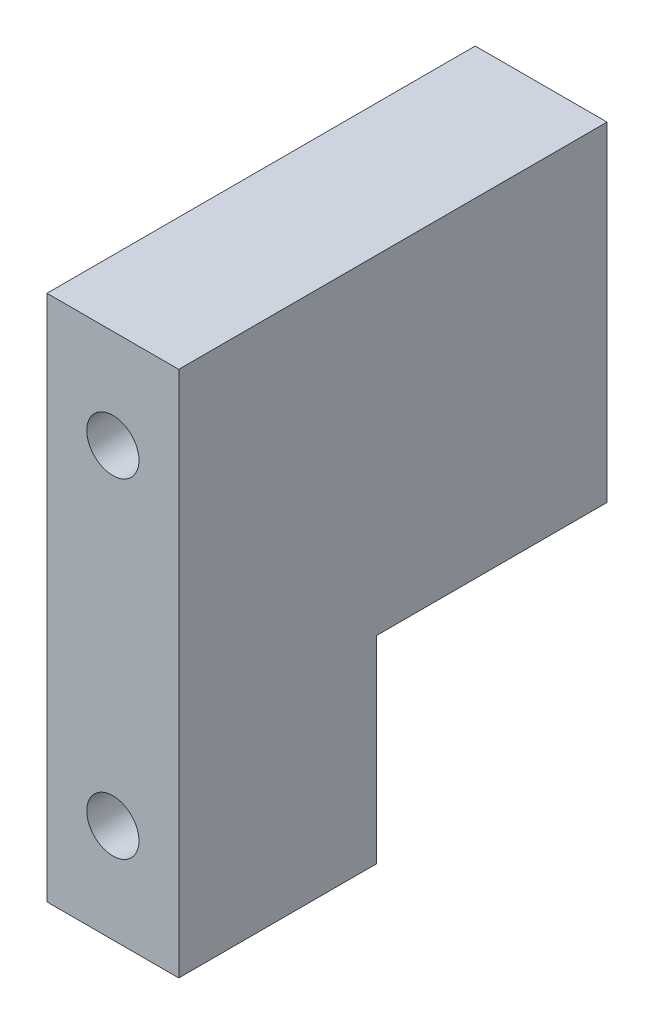
ISO-10303-21;
HEADER;
FILE_DESCRIPTION(('STEP AP214'),'2;1');
FILE_NAME('part.step','',(''),(''),'','','');
FILE_SCHEMA(('AUTOMOTIVE_DESIGN { 1 0 10303 214 1 1 1 1 }'));
ENDSEC;
DATA;
#1=APPLICATION_CONTEXT('core data for automotive mechanical design processes');
#2=APPLICATION_PROTOCOL_DEFINITION('international standard','automotive_design',2000,#1);
#3=PRODUCT_CONTEXT('',#1,'mechanical');
#4=PRODUCT('Part','Part','',(#3));
#5=PRODUCT_RELATED_PRODUCT_CATEGORY('part','',(#4));
#6=PRODUCT_DEFINITION_FORMATION('','',#4);
#7=PRODUCT_DEFINITION_CONTEXT('part definition',#1,'design');
#8=PRODUCT_DEFINITION('design','',#6,#7);
#9=PRODUCT_DEFINITION_SHAPE('','',#8);
#10=(LENGTH_UNIT() NAMED_UNIT(*) SI_UNIT(.MILLI.,.METRE.));
#11=(NAMED_UNIT(*) PLANE_ANGLE_UNIT() SI_UNIT($,.RADIAN.));
#12=(NAMED_UNIT(*) SI_UNIT($,.STERADIAN.) SOLID_ANGLE_UNIT());
#13=UNCERTAINTY_MEASURE_WITH_UNIT(LENGTH_MEASURE(1.E-05),#10,'distance_accuracy_value','');
#14=(GEOMETRIC_REPRESENTATION_CONTEXT(3) GLOBAL_UNCERTAINTY_ASSIGNED_CONTEXT((#13)) GLOBAL_UNIT_ASSIGNED_CONTEXT((#10,
#11,#12)) REPRESENTATION_CONTEXT('',''));
#15=CARTESIAN_POINT('',(0.,0.,0.));
#16=DIRECTION('',(0.,0.,1.));
#17=DIRECTION('',(1.,0.,0.));
#18=AXIS2_PLACEMENT_3D('',#15,#16,#17);
#19=CARTESIAN_POINT('',(-34.925,25.4,-12.7));
#20=DIRECTION('',(1.,0.,0.));
#21=DIRECTION('',(0.,1.,0.));
#22=AXIS2_PLACEMENT_3D('',#19,#20,#21);
#23=PLANE('',#22);
#24=DIRECTION('',(0.,-1.,0.));
#25=VECTOR('',#24,1.);
#26=CARTESIAN_POINT('',(-34.925,-37.7025222840827,9.525));
#27=LINE('',#26,#25);
#28=CARTESIAN_POINT('',(-34.925,-6.35,9.525));
#29=VERTEX_POINT('',#28);
#30=CARTESIAN_POINT('',(-34.925,-25.4,9.525));
#31=VERTEX_POINT('',#30);
#32=EDGE_CURVE('E107',#29,#31,#27,.T.);
#33=ORIENTED_EDGE('',*,*,#32,.F.);
#34=DIRECTION('',(0.,0.,1.));
#35=VECTOR('',#34,1.);
#36=CARTESIAN_POINT('',(-34.925,-6.35,-12.7));
#37=LINE('',#36,#35);
#38=CARTESIAN_POINT('',(-34.925,-6.35,-12.7));
#39=VERTEX_POINT('',#38);
#40=EDGE_CURVE('E101',#39,#29,#37,.T.);
#41=ORIENTED_EDGE('',*,*,#40,.F.);
#42=DIRECTION('',(0.,1.,0.));
#43=VECTOR('',#42,1.);
#44=CARTESIAN_POINT('',(-34.925,25.4,-12.7));
#45=LINE('',#44,#43);
#46=CARTESIAN_POINT('',(-34.925,25.4,-12.7));
#47=VERTEX_POINT('',#46);
#48=EDGE_CURVE('E87',#39,#47,#45,.T.);
#49=ORIENTED_EDGE('',*,*,#48,.T.);
#50=DIRECTION('',(0.,0.,1.));
#51=VECTOR('',#50,1.);
#52=CARTESIAN_POINT('',(-34.925,25.4,-12.7));
#53=LINE('',#52,#51);
#54=CARTESIAN_POINT('',(-34.925,25.4,28.575));
#55=VERTEX_POINT('',#54);
#56=EDGE_CURVE('E11',#47,#55,#53,.T.);
#57=ORIENTED_EDGE('',*,*,#56,.T.);
#58=DIRECTION('',(0.,-1.,0.));
#59=VECTOR('',#58,1.);
#60=CARTESIAN_POINT('',(-34.925,25.4,28.575));
#61=LINE('',#60,#59);
#62=CARTESIAN_POINT('',(-34.925,-25.4,28.575));
#63=VERTEX_POINT('',#62);
#64=EDGE_CURVE('E155',#55,#63,#61,.T.);
#65=ORIENTED_EDGE('',*,*,#64,.T.);
#66=DIRECTION('',(0.,0.,-1.));
#67=VECTOR('',#66,1.);
#68=CARTESIAN_POINT('',(-34.925,-25.4,-12.7));
#69=LINE('',#68,#67);
#70=EDGE_CURVE('E92',#63,#31,#69,.T.);
#71=ORIENTED_EDGE('',*,*,#70,.T.);
#72=EDGE_LOOP('',(#33,#41,#49,#57,#65,#71));
#73=FACE_BOUND('',#72,.T.);
#74=ADVANCED_FACE('F17',(#73),#23,.T.);
#75=CARTESIAN_POINT('',(-47.625,25.4,-12.7));
#76=DIRECTION('',(0.,1.,0.));
#77=DIRECTION('',(1.,0.,0.));
#78=AXIS2_PLACEMENT_3D('',#75,#76,#77);
#79=PLANE('',#78);
#80=DIRECTION('',(-1.,0.,0.));
#81=VECTOR('',#80,1.);
#82=CARTESIAN_POINT('',(-47.625,25.4,-12.7));
#83=LINE('',#82,#81);
#84=CARTESIAN_POINT('',(-47.625,25.4,-12.7));
#85=VERTEX_POINT('',#84);
#86=EDGE_CURVE('E25',#47,#85,#83,.T.);
#87=ORIENTED_EDGE('',*,*,#86,.T.);
#88=DIRECTION('',(0.,0.,1.));
#89=VECTOR('',#88,1.);
#90=CARTESIAN_POINT('',(-47.625,25.4,-12.7));
#91=LINE('',#90,#89);
#92=CARTESIAN_POINT('',(-47.625,25.4,28.575));
#93=VERTEX_POINT('',#92);
#94=EDGE_CURVE('E142',#85,#93,#91,.T.);
#95=ORIENTED_EDGE('',*,*,#94,.T.);
#96=DIRECTION('',(1.,0.,0.));
#97=VECTOR('',#96,1.);
#98=CARTESIAN_POINT('',(-47.625,25.4,28.575));
#99=LINE('',#98,#97);
#100=EDGE_CURVE('E144',#93,#55,#99,.T.);
#101=ORIENTED_EDGE('',*,*,#100,.T.);
#102=ORIENTED_EDGE('',*,*,#56,.F.);
#103=EDGE_LOOP('',(#87,#95,#101,#102));
#104=FACE_BOUND('',#103,.T.);
#105=ADVANCED_FACE('F159',(#104),#79,.T.);
#106=CARTESIAN_POINT('',(-41.275,0.,-12.7));
#107=DIRECTION('',(0.,0.,1.));
#108=DIRECTION('',(1.,0.,0.));
#109=AXIS2_PLACEMENT_3D('',#106,#107,#108);
#110=PLANE('',#109);
#111=CARTESIAN_POINT('',(-41.275,15.875,-12.7));
#112=DIRECTION('',(0.,0.,-1.));
#113=DIRECTION('',(-1.,0.,0.));
#114=AXIS2_PLACEMENT_3D('',#111,#112,#113);
#115=CIRCLE('',#114,2.286);
#116=CARTESIAN_POINT('',(-43.561,15.875,-12.7));
#117=VERTEX_POINT('',#116);
#118=EDGE_CURVE('E115',#117,#117,#115,.T.);
#119=ORIENTED_EDGE('',*,*,#118,.F.);
#120=EDGE_LOOP('',(#119));
#121=FACE_BOUND('',#120,.T.);
#122=ORIENTED_EDGE('',*,*,#48,.F.);
#123=DIRECTION('',(-1.,0.,0.));
#124=VECTOR('',#123,1.);
#125=CARTESIAN_POINT('',(-41.275,-6.35,-12.7));
#126=LINE('',#125,#124);
#127=CARTESIAN_POINT('',(-47.625,-6.35,-12.7));
#128=VERTEX_POINT('',#127);
#129=EDGE_CURVE('E93',#39,#128,#126,.T.);
#130=ORIENTED_EDGE('',*,*,#129,.T.);
#131=DIRECTION('',(0.,-1.,0.));
#132=VECTOR('',#131,1.);
#133=CARTESIAN_POINT('',(-47.625,0.,-12.7));
#134=LINE('',#133,#132);
#135=EDGE_CURVE('E148',#85,#128,#134,.T.);
#136=ORIENTED_EDGE('',*,*,#135,.F.);
#137=ORIENTED_EDGE('',*,*,#86,.F.);
#138=EDGE_LOOP('',(#122,#130,#136,#137));
#139=FACE_BOUND('',#138,.T.);
#140=ADVANCED_FACE('F90',(#121,#139),#110,.F.);
#141=CARTESIAN_POINT('',(-34.925,-25.4,-12.7));
#142=DIRECTION('',(0.,-1.,0.));
#143=DIRECTION('',(0.,0.,-1.));
#144=AXIS2_PLACEMENT_3D('',#141,#142,#143);
#145=PLANE('',#144);
#146=DIRECTION('',(-1.,0.,0.));
#147=VECTOR('',#146,1.);
#148=CARTESIAN_POINT('',(-34.925,-25.4,9.525));
#149=LINE('',#148,#147);
#150=CARTESIAN_POINT('',(-47.625,-25.4,9.525));
#151=VERTEX_POINT('',#150);
#152=EDGE_CURVE('E104',#31,#151,#149,.T.);
#153=ORIENTED_EDGE('',*,*,#152,.F.);
#154=ORIENTED_EDGE('',*,*,#70,.F.);
#155=DIRECTION('',(-1.,0.,0.));
#156=VECTOR('',#155,1.);
#157=CARTESIAN_POINT('',(-34.925,-25.4,28.575));
#158=LINE('',#157,#156);
#159=CARTESIAN_POINT('',(-47.625,-25.4,28.575));
#160=VERTEX_POINT('',#159);
#161=EDGE_CURVE('E149',#63,#160,#158,.T.);
#162=ORIENTED_EDGE('',*,*,#161,.T.);
#163=DIRECTION('',(0.,0.,-1.));
#164=VECTOR('',#163,1.);
#165=CARTESIAN_POINT('',(-47.625,-25.4,-12.7));
#166=LINE('',#165,#164);
#167=EDGE_CURVE('E134',#160,#151,#166,.T.);
#168=ORIENTED_EDGE('',*,*,#167,.T.);
#169=EDGE_LOOP('',(#153,#154,#162,#168));
#170=FACE_BOUND('',#169,.T.);
#171=ADVANCED_FACE('F218',(#170),#145,.T.);
#172=CARTESIAN_POINT('',(0.,0.,28.575));
#173=DIRECTION('',(0.,0.,1.));
#174=DIRECTION('',(1.,0.,0.));
#175=AXIS2_PLACEMENT_3D('',#172,#173,#174);
#176=PLANE('',#175);
#177=CARTESIAN_POINT('',(-41.275,-15.875,28.575));
#178=DIRECTION('',(0.,0.,1.));
#179=DIRECTION('',(1.,0.,0.));
#180=AXIS2_PLACEMENT_3D('',#177,#178,#179);
#181=CIRCLE('',#180,2.5146);
#182=CARTESIAN_POINT('',(-38.7604,-15.875,28.575));
#183=VERTEX_POINT('',#182);
#184=EDGE_CURVE('E180',#183,#183,#181,.T.);
#185=ORIENTED_EDGE('',*,*,#184,.F.);
#186=EDGE_LOOP('',(#185));
#187=FACE_BOUND('',#186,.T.);
#188=CARTESIAN_POINT('',(-41.275,15.875,28.575));
#189=DIRECTION('',(0.,0.,1.));
#190=DIRECTION('',(1.,0.,0.));
#191=AXIS2_PLACEMENT_3D('',#188,#189,#190);
#192=CIRCLE('',#191,2.5146);
#193=CARTESIAN_POINT('',(-38.7604,15.875,28.575));
#194=VERTEX_POINT('',#193);
#195=EDGE_CURVE('E176',#194,#194,#192,.T.);
#196=ORIENTED_EDGE('',*,*,#195,.F.);
#197=EDGE_LOOP('',(#196));
#198=FACE_BOUND('',#197,.T.);
#199=DIRECTION('',(0.,-1.,0.));
#200=VECTOR('',#199,1.);
#201=CARTESIAN_POINT('',(-47.625,0.,28.575));
#202=LINE('',#201,#200);
#203=EDGE_CURVE('E138',#93,#160,#202,.T.);
#204=ORIENTED_EDGE('',*,*,#203,.T.);
#205=ORIENTED_EDGE('',*,*,#161,.F.);
#206=ORIENTED_EDGE('',*,*,#64,.F.);
#207=ORIENTED_EDGE('',*,*,#100,.F.);
#208=EDGE_LOOP('',(#204,#205,#206,#207));
#209=FACE_BOUND('',#208,.T.);
#210=ADVANCED_FACE('F240',(#187,#198,#209),#176,.T.);
#211=CARTESIAN_POINT('',(-47.625,-25.4,-12.7));
#212=DIRECTION('',(-1.,0.,0.));
#213=DIRECTION('',(0.,0.,1.));
#214=AXIS2_PLACEMENT_3D('',#211,#212,#213);
#215=PLANE('',#214);
#216=DIRECTION('',(0.,-1.,0.));
#217=VECTOR('',#216,1.);
#218=CARTESIAN_POINT('',(-47.625,-37.7025222840827,9.525));
#219=LINE('',#218,#217);
#220=CARTESIAN_POINT('',(-47.625,-6.35,9.525));
#221=VERTEX_POINT('',#220);
#222=EDGE_CURVE('E131',#221,#151,#219,.T.);
#223=ORIENTED_EDGE('',*,*,#222,.T.);
#224=ORIENTED_EDGE('',*,*,#167,.F.);
#225=ORIENTED_EDGE('',*,*,#203,.F.);
#226=ORIENTED_EDGE('',*,*,#94,.F.);
#227=ORIENTED_EDGE('',*,*,#135,.T.);
#228=DIRECTION('',(0.,0.,1.));
#229=VECTOR('',#228,1.);
#230=CARTESIAN_POINT('',(-47.625,-6.35,-31.9741630263985));
#231=LINE('',#230,#229);
#232=EDGE_CURVE('E103',#128,#221,#231,.T.);
#233=ORIENTED_EDGE('',*,*,#232,.T.);
#234=EDGE_LOOP('',(#223,#224,#225,#226,#227,#233));
#235=FACE_BOUND('',#234,.T.);
#236=ADVANCED_FACE('F163',(#235),#215,.T.);
#237=CARTESIAN_POINT('',(-47.625,-37.7025222840827,9.525));
#238=DIRECTION('',(0.,0.,1.));
#239=DIRECTION('',(1.,0.,0.));
#240=AXIS2_PLACEMENT_3D('',#237,#238,#239);
#241=PLANE('',#240);
#242=CARTESIAN_POINT('',(-41.275,-15.875,9.525));
#243=DIRECTION('',(0.,0.,-1.));
#244=DIRECTION('',(1.,0.,0.));
#245=AXIS2_PLACEMENT_3D('',#242,#243,#244);
#246=CIRCLE('',#245,2.286);
#247=CARTESIAN_POINT('',(-38.989,-15.875,9.525));
#248=VERTEX_POINT('',#247);
#249=EDGE_CURVE('E181',#248,#248,#246,.T.);
#250=ORIENTED_EDGE('',*,*,#249,.F.);
#251=EDGE_LOOP('',(#250));
#252=FACE_BOUND('',#251,.T.);
#253=ORIENTED_EDGE('',*,*,#152,.T.);
#254=ORIENTED_EDGE('',*,*,#222,.F.);
#255=DIRECTION('',(1.,0.,0.));
#256=VECTOR('',#255,1.);
#257=CARTESIAN_POINT('',(-47.625,-6.35,9.525));
#258=LINE('',#257,#256);
#259=EDGE_CURVE('E112',#221,#29,#258,.T.);
#260=ORIENTED_EDGE('',*,*,#259,.T.);
#261=ORIENTED_EDGE('',*,*,#32,.T.);
#262=EDGE_LOOP('',(#253,#254,#260,#261));
#263=FACE_BOUND('',#262,.T.);
#264=ADVANCED_FACE('F221',(#252,#263),#241,.F.);
#265=CARTESIAN_POINT('',(-47.625,-6.35,-31.9741630263985));
#266=DIRECTION('',(0.,1.,0.));
#267=DIRECTION('',(1.,0.,0.));
#268=AXIS2_PLACEMENT_3D('',#265,#266,#267);
#269=PLANE('',#268);
#270=ORIENTED_EDGE('',*,*,#40,.T.);
#271=ORIENTED_EDGE('',*,*,#259,.F.);
#272=ORIENTED_EDGE('',*,*,#232,.F.);
#273=ORIENTED_EDGE('',*,*,#129,.F.);
#274=EDGE_LOOP('',(#270,#271,#272,#273));
#275=FACE_BOUND('',#274,.T.);
#276=ADVANCED_FACE('F97',(#275),#269,.F.);
#277=CARTESIAN_POINT('',(-41.275,15.875,13.335));
#278=DIRECTION('',(0.,0.,1.));
#279=DIRECTION('',(1.,0.,0.));
#280=AXIS2_PLACEMENT_3D('',#277,#278,#279);
#281=PLANE('',#280);
#282=CARTESIAN_POINT('',(-41.275,15.875,13.335));
#283=DIRECTION('',(0.,0.,-1.));
#284=DIRECTION('',(1.,0.,0.));
#285=AXIS2_PLACEMENT_3D('',#282,#283,#284);
#286=CIRCLE('',#285,2.286);
#287=CARTESIAN_POINT('',(-38.989,15.875,13.335));
#288=VERTEX_POINT('',#287);
#289=EDGE_CURVE('E125',#288,#288,#286,.T.);
#290=ORIENTED_EDGE('',*,*,#289,.T.);
#291=EDGE_LOOP('',(#290));
#292=FACE_BOUND('',#291,.T.);
#293=CARTESIAN_POINT('',(-41.275,15.875,13.335));
#294=DIRECTION('',(0.,0.,1.));
#295=DIRECTION('',(1.,0.,0.));
#296=AXIS2_PLACEMENT_3D('',#293,#294,#295);
#297=CIRCLE('',#296,2.5146);
#298=CARTESIAN_POINT('',(-38.7604,15.875,13.335));
#299=VERTEX_POINT('',#298);
#300=EDGE_CURVE('E172',#299,#299,#297,.T.);
#301=ORIENTED_EDGE('',*,*,#300,.T.);
#302=EDGE_LOOP('',(#301));
#303=FACE_BOUND('',#302,.T.);
#304=ADVANCED_FACE('F229',(#292,#303),#281,.T.);
#305=CARTESIAN_POINT('',(-41.275,-15.875,13.335));
#306=DIRECTION('',(0.,0.,1.));
#307=DIRECTION('',(1.,0.,0.));
#308=AXIS2_PLACEMENT_3D('',#305,#306,#307);
#309=PLANE('',#308);
#310=CARTESIAN_POINT('',(-41.275,-15.875,13.335));
#311=DIRECTION('',(0.,0.,-1.));
#312=DIRECTION('',(1.,0.,0.));
#313=AXIS2_PLACEMENT_3D('',#310,#311,#312);
#314=CIRCLE('',#313,2.286);
#315=CARTESIAN_POINT('',(-38.989,-15.875,13.335));
#316=VERTEX_POINT('',#315);
#317=EDGE_CURVE('E185',#316,#316,#314,.T.);
#318=ORIENTED_EDGE('',*,*,#317,.T.);
#319=EDGE_LOOP('',(#318));
#320=FACE_BOUND('',#319,.T.);
#321=CARTESIAN_POINT('',(-41.275,-15.875,13.335));
#322=DIRECTION('',(0.,0.,1.));
#323=DIRECTION('',(1.,0.,0.));
#324=AXIS2_PLACEMENT_3D('',#321,#322,#323);
#325=CIRCLE('',#324,2.5146);
#326=CARTESIAN_POINT('',(-38.7604,-15.875,13.335));
#327=VERTEX_POINT('',#326);
#328=EDGE_CURVE('E323',#327,#327,#325,.T.);
#329=ORIENTED_EDGE('',*,*,#328,.T.);
#330=EDGE_LOOP('',(#329));
#331=FACE_BOUND('',#330,.T.);
#332=ADVANCED_FACE('F195',(#320,#331),#309,.T.);
#333=CARTESIAN_POINT('',(-41.275,15.875,-38.1));
#334=DIRECTION('',(0.,0.,-1.));
#335=DIRECTION('',(-1.,0.,0.));
#336=AXIS2_PLACEMENT_3D('',#333,#334,#335);
#337=CYLINDRICAL_SURFACE('',#336,2.286);
#338=ORIENTED_EDGE('',*,*,#118,.T.);
#339=EDGE_LOOP('',(#338));
#340=FACE_BOUND('',#339,.T.);
#341=ORIENTED_EDGE('',*,*,#289,.F.);
#342=EDGE_LOOP('',(#341));
#343=FACE_BOUND('',#342,.T.);
#344=ADVANCED_FACE('F196',(#340,#343),#337,.F.);
#345=CARTESIAN_POINT('',(-41.275,-15.875,-38.1));
#346=DIRECTION('',(0.,0.,-1.));
#347=DIRECTION('',(-1.,0.,0.));
#348=AXIS2_PLACEMENT_3D('',#345,#346,#347);
#349=CYLINDRICAL_SURFACE('',#348,2.286);
#350=ORIENTED_EDGE('',*,*,#249,.T.);
#351=EDGE_LOOP('',(#350));
#352=FACE_BOUND('',#351,.T.);
#353=ORIENTED_EDGE('',*,*,#317,.F.);
#354=EDGE_LOOP('',(#353));
#355=FACE_BOUND('',#354,.T.);
#356=ADVANCED_FACE('F194',(#352,#355),#349,.F.);
#357=CARTESIAN_POINT('',(-41.275,15.875,13.335));
#358=DIRECTION('',(0.,0.,1.));
#359=DIRECTION('',(1.,0.,0.));
#360=AXIS2_PLACEMENT_3D('',#357,#358,#359);
#361=CYLINDRICAL_SURFACE('',#360,2.5146);
#362=ORIENTED_EDGE('',*,*,#195,.T.);
#363=EDGE_LOOP('',(#362));
#364=FACE_BOUND('',#363,.T.);
#365=ORIENTED_EDGE('',*,*,#300,.F.);
#366=EDGE_LOOP('',(#365));
#367=FACE_BOUND('',#366,.T.);
#368=ADVANCED_FACE('F197',(#364,#367),#361,.F.);
#369=CARTESIAN_POINT('',(-41.275,-15.875,13.335));
#370=DIRECTION('',(0.,0.,1.));
#371=DIRECTION('',(1.,0.,0.));
#372=AXIS2_PLACEMENT_3D('',#369,#370,#371);
#373=CYLINDRICAL_SURFACE('',#372,2.5146);
#374=ORIENTED_EDGE('',*,*,#184,.T.);
#375=EDGE_LOOP('',(#374));
#376=FACE_BOUND('',#375,.T.);
#377=ORIENTED_EDGE('',*,*,#328,.F.);
#378=EDGE_LOOP('',(#377));
#379=FACE_BOUND('',#378,.T.);
#380=ADVANCED_FACE('F206',(#376,#379),#373,.F.);
#381=CLOSED_SHELL('',(#74,#105,#140,#171,#210,#236,#264,#276,#304,#332,#344,#356,#368,#380));
#382=MANIFOLD_SOLID_BREP('B1',#381);
#383=ADVANCED_BREP_SHAPE_REPRESENTATION('',(#18,#382),#14);
#384=SHAPE_DEFINITION_REPRESENTATION(#9,#383);
ENDSEC;
END-ISO-10303-21;
